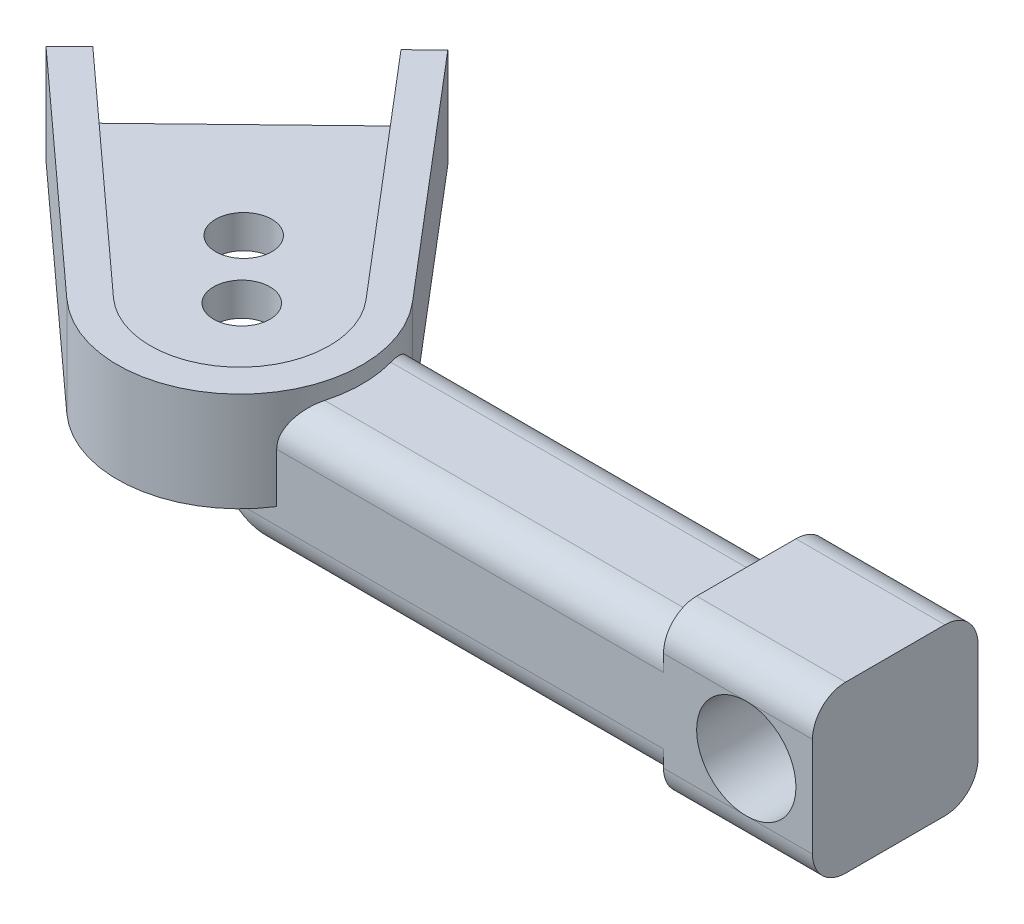
ISO-10303-21;
HEADER;
FILE_DESCRIPTION(('STEP AP214'),'2;1');
FILE_NAME('part.step','',(''),(''),'','','');
FILE_SCHEMA(('AUTOMOTIVE_DESIGN { 1 0 10303 214 1 1 1 1 }'));
ENDSEC;
DATA;
#1=APPLICATION_CONTEXT('core data for automotive mechanical design processes');
#2=APPLICATION_PROTOCOL_DEFINITION('international standard','automotive_design',2000,#1);
#3=PRODUCT_CONTEXT('',#1,'mechanical');
#4=PRODUCT('Part','Part','',(#3));
#5=PRODUCT_RELATED_PRODUCT_CATEGORY('part','',(#4));
#6=PRODUCT_DEFINITION_FORMATION('','',#4);
#7=PRODUCT_DEFINITION_CONTEXT('part definition',#1,'design');
#8=PRODUCT_DEFINITION('design','',#6,#7);
#9=PRODUCT_DEFINITION_SHAPE('','',#8);
#10=(LENGTH_UNIT() NAMED_UNIT(*) SI_UNIT(.MILLI.,.METRE.));
#11=(NAMED_UNIT(*) PLANE_ANGLE_UNIT() SI_UNIT($,.RADIAN.));
#12=(NAMED_UNIT(*) SI_UNIT($,.STERADIAN.) SOLID_ANGLE_UNIT());
#13=UNCERTAINTY_MEASURE_WITH_UNIT(LENGTH_MEASURE(1.E-05),#10,'distance_accuracy_value','');
#14=(GEOMETRIC_REPRESENTATION_CONTEXT(3) GLOBAL_UNCERTAINTY_ASSIGNED_CONTEXT((#13)) GLOBAL_UNIT_ASSIGNED_CONTEXT((#10,
#11,#12)) REPRESENTATION_CONTEXT('',''));
#15=CARTESIAN_POINT('',(0.,0.,0.));
#16=DIRECTION('',(0.,0.,1.));
#17=DIRECTION('',(1.,0.,0.));
#18=AXIS2_PLACEMENT_3D('',#15,#16,#17);
#19=CARTESIAN_POINT('',(0.,0.,2.));
#20=DIRECTION('',(0.,0.,1.));
#21=DIRECTION('',(1.,0.,0.));
#22=AXIS2_PLACEMENT_3D('',#19,#20,#21);
#23=PLANE('',#22);
#24=DIRECTION('',(0.,1.,0.));
#25=VECTOR('',#24,1.);
#26=CARTESIAN_POINT('',(10.25,2.,2.));
#27=LINE('',#26,#25);
#28=CARTESIAN_POINT('',(10.25,-1.5,2.));
#29=VERTEX_POINT('',#28);
#30=CARTESIAN_POINT('',(10.25,1.5,2.));
#31=VERTEX_POINT('',#30);
#32=EDGE_CURVE('E337',#29,#31,#27,.T.);
#33=ORIENTED_EDGE('',*,*,#32,.T.);
#34=DIRECTION('',(-1.,0.,0.));
#35=VECTOR('',#34,1.);
#36=CARTESIAN_POINT('',(0.,1.5,2.));
#37=LINE('',#36,#35);
#38=CARTESIAN_POINT('',(8.25,1.5,2.));
#39=VERTEX_POINT('',#38);
#40=EDGE_CURVE('E11',#31,#39,#37,.T.);
#41=ORIENTED_EDGE('',*,*,#40,.T.);
#42=CARTESIAN_POINT('',(8.25,0.,2.));
#43=DIRECTION('',(0.,0.,1.));
#44=DIRECTION('',(1.,0.,0.));
#45=AXIS2_PLACEMENT_3D('',#42,#43,#44);
#46=CIRCLE('',#45,1.5);
#47=CARTESIAN_POINT('',(8.25,-1.5,2.));
#48=VERTEX_POINT('',#47);
#49=EDGE_CURVE('E385',#48,#39,#46,.T.);
#50=ORIENTED_EDGE('',*,*,#49,.F.);
#51=DIRECTION('',(1.,0.,0.));
#52=VECTOR('',#51,1.);
#53=CARTESIAN_POINT('',(0.,-1.5,2.));
#54=LINE('',#53,#52);
#55=EDGE_CURVE('E49',#48,#29,#54,.T.);
#56=ORIENTED_EDGE('',*,*,#55,.T.);
#57=EDGE_LOOP('',(#33,#41,#50,#56));
#58=FACE_BOUND('',#57,.T.);
#59=ADVANCED_FACE('F34',(#58),#23,.T.);
#60=CARTESIAN_POINT('',(0.,0.,-3.));
#61=DIRECTION('',(0.,0.,1.));
#62=DIRECTION('',(1.,0.,0.));
#63=AXIS2_PLACEMENT_3D('',#60,#61,#62);
#64=PLANE('',#63);
#65=DIRECTION('',(0.,1.,0.));
#66=VECTOR('',#65,1.);
#67=CARTESIAN_POINT('',(10.25,-2.5,-3.));
#68=LINE('',#67,#66);
#69=CARTESIAN_POINT('',(10.25,-1.5,-3.));
#70=VERTEX_POINT('',#69);
#71=CARTESIAN_POINT('',(10.25,1.5,-3.));
#72=VERTEX_POINT('',#71);
#73=EDGE_CURVE('E393',#70,#72,#68,.T.);
#74=ORIENTED_EDGE('',*,*,#73,.F.);
#75=DIRECTION('',(1.,0.,0.));
#76=VECTOR('',#75,1.);
#77=CARTESIAN_POINT('',(5.75,-1.5,-3.));
#78=LINE('',#77,#76);
#79=CARTESIAN_POINT('',(8.25,-1.5,-3.));
#80=VERTEX_POINT('',#79);
#81=EDGE_CURVE('E365',#70,#80,#78,.F.);
#82=ORIENTED_EDGE('',*,*,#81,.T.);
#83=CARTESIAN_POINT('',(8.25,0.,-3.));
#84=DIRECTION('',(0.,0.,1.));
#85=DIRECTION('',(1.,0.,0.));
#86=AXIS2_PLACEMENT_3D('',#83,#84,#85);
#87=CIRCLE('',#86,1.5);
#88=CARTESIAN_POINT('',(8.25,1.5,-3.));
#89=VERTEX_POINT('',#88);
#90=EDGE_CURVE('E550',#80,#89,#87,.T.);
#91=ORIENTED_EDGE('',*,*,#90,.T.);
#92=DIRECTION('',(-1.,0.,0.));
#93=VECTOR('',#92,1.);
#94=CARTESIAN_POINT('',(10.25,1.5,-3.));
#95=LINE('',#94,#93);
#96=EDGE_CURVE('E359',#89,#72,#95,.F.);
#97=ORIENTED_EDGE('',*,*,#96,.T.);
#98=EDGE_LOOP('',(#74,#82,#91,#97));
#99=FACE_BOUND('',#98,.T.);
#100=ADVANCED_FACE('F326',(#99),#64,.F.);
#101=CARTESIAN_POINT('',(-9.048459148222,2.5,0.));
#102=DIRECTION('',(0.,-1.,0.));
#103=DIRECTION('',(0.,0.,-1.));
#104=AXIS2_PLACEMENT_3D('',#101,#102,#103);
#105=CYLINDRICAL_SURFACE('',#104,2.70313224699939);
#106=CARTESIAN_POINT('',(-9.048459148222,0.500000000000001,0.));
#107=DIRECTION('',(0.,-1.,0.));
#108=DIRECTION('',(0.,0.,-1.));
#109=AXIS2_PLACEMENT_3D('',#106,#107,#108);
#110=CIRCLE('',#109,2.70313224699939);
#111=CARTESIAN_POINT('',(-6.98942026153455,0.500000000000001,-1.75136598341891));
#112=VERTEX_POINT('',#111);
#113=CARTESIAN_POINT('',(-10.8670736672092,0.500000000000001,1.99989129106982));
#114=VERTEX_POINT('',#113);
#115=EDGE_CURVE('E431',#112,#114,#110,.T.);
#116=ORIENTED_EDGE('',*,*,#115,.T.);
#117=DIRECTION('',(0.,-1.,0.));
#118=VECTOR('',#117,1.);
#119=CARTESIAN_POINT('',(-10.8670736672092,2.5,1.99989129106982));
#120=LINE('',#119,#118);
#121=CARTESIAN_POINT('',(-10.8670736672092,2.5,1.99989129106982));
#122=VERTEX_POINT('',#121);
#123=EDGE_CURVE('E457',#122,#114,#120,.T.);
#124=ORIENTED_EDGE('',*,*,#123,.F.);
#125=CARTESIAN_POINT('',(-9.048459148222,2.5,0.));
#126=DIRECTION('',(0.,-1.,0.));
#127=DIRECTION('',(0.,0.,-1.));
#128=AXIS2_PLACEMENT_3D('',#125,#126,#127);
#129=CIRCLE('',#128,2.70313224699939);
#130=CARTESIAN_POINT('',(-6.98942026153455,2.5,-1.75136598341891));
#131=VERTEX_POINT('',#130);
#132=EDGE_CURVE('E448',#131,#122,#129,.T.);
#133=ORIENTED_EDGE('',*,*,#132,.F.);
#134=DIRECTION('',(0.,-1.,0.));
#135=VECTOR('',#134,1.);
#136=CARTESIAN_POINT('',(-6.98942026153455,2.5,-1.75136598341891));
#137=LINE('',#136,#135);
#138=EDGE_CURVE('E458',#131,#112,#137,.T.);
#139=ORIENTED_EDGE('',*,*,#138,.T.);
#140=EDGE_LOOP('',(#116,#124,#133,#139));
#141=FACE_BOUND('',#140,.T.);
#142=ADVANCED_FACE('F331',(#141),#105,.F.);
#143=CARTESIAN_POINT('',(-13.0110338618794,2.5,-8.83083234344946));
#144=DIRECTION('',(0.761723326327479,0.,-0.647902441829478));
#145=DIRECTION('',(-0.647902441829478,0.,-0.761723326327479));
#146=AXIS2_PLACEMENT_3D('',#143,#144,#145);
#147=PLANE('',#146);
#148=DIRECTION('',(0.647902441829478,0.,0.761723326327479));
#149=VECTOR('',#148,1.);
#150=CARTESIAN_POINT('',(-13.0110338618794,0.500000000000001,-8.83083234344946));
#151=LINE('',#150,#149);
#152=CARTESIAN_POINT('',(-13.0110338618794,0.500000000000001,-8.83083234344946));
#153=VERTEX_POINT('',#152);
#154=EDGE_CURVE('E446',#153,#112,#151,.T.);
#155=ORIENTED_EDGE('',*,*,#154,.T.);
#156=ORIENTED_EDGE('',*,*,#138,.F.);
#157=DIRECTION('',(0.647902441829478,0.,0.761723326327479));
#158=VECTOR('',#157,1.);
#159=CARTESIAN_POINT('',(-13.0110338618794,2.5,-8.83083234344946));
#160=LINE('',#159,#158);
#161=CARTESIAN_POINT('',(-13.0110338618794,2.5,-8.83083234344946));
#162=VERTEX_POINT('',#161);
#163=EDGE_CURVE('E454',#162,#131,#160,.T.);
#164=ORIENTED_EDGE('',*,*,#163,.F.);
#165=DIRECTION('',(0.,-1.,0.));
#166=VECTOR('',#165,1.);
#167=CARTESIAN_POINT('',(-13.0110338618794,2.5,-8.83083234344946));
#168=LINE('',#167,#166);
#169=EDGE_CURVE('E480',#162,#153,#168,.T.);
#170=ORIENTED_EDGE('',*,*,#169,.T.);
#171=EDGE_LOOP('',(#155,#156,#164,#170));
#172=FACE_BOUND('',#171,.T.);
#173=ADVANCED_FACE('F603',(#172),#147,.F.);
#174=CARTESIAN_POINT('',(-17.7428729960787,2.5,-4.25266280772598));
#175=DIRECTION('',(-0.672780446093956,0.,0.739842193547798));
#176=DIRECTION('',(0.739842193547798,0.,0.672780446093956));
#177=AXIS2_PLACEMENT_3D('',#174,#175,#176);
#178=PLANE('',#177);
#179=DIRECTION('',(-0.739842193547798,0.,-0.672780446093956));
#180=VECTOR('',#179,1.);
#181=CARTESIAN_POINT('',(-17.7428729960787,0.500000000000001,-4.25266280772598));
#182=LINE('',#181,#180);
#183=CARTESIAN_POINT('',(-17.7428729960787,0.500000000000001,-4.25266280772598));
#184=VERTEX_POINT('',#183);
#185=EDGE_CURVE('E441',#114,#184,#182,.T.);
#186=ORIENTED_EDGE('',*,*,#185,.T.);
#187=DIRECTION('',(0.,-1.,0.));
#188=VECTOR('',#187,1.);
#189=CARTESIAN_POINT('',(-17.7428729960787,2.5,-4.25266280772598));
#190=LINE('',#189,#188);
#191=CARTESIAN_POINT('',(-17.7428729960787,2.5,-4.25266280772598));
#192=VERTEX_POINT('',#191);
#193=EDGE_CURVE('E492',#192,#184,#190,.T.);
#194=ORIENTED_EDGE('',*,*,#193,.F.);
#195=DIRECTION('',(-0.739842193547798,0.,-0.672780446093956));
#196=VECTOR('',#195,1.);
#197=CARTESIAN_POINT('',(-17.7428729960787,2.5,-4.25266280772598));
#198=LINE('',#197,#196);
#199=EDGE_CURVE('E451',#122,#192,#198,.T.);
#200=ORIENTED_EDGE('',*,*,#199,.F.);
#201=ORIENTED_EDGE('',*,*,#123,.T.);
#202=EDGE_LOOP('',(#186,#194,#200,#201));
#203=FACE_BOUND('',#202,.T.);
#204=ADVANCED_FACE('F303',(#203),#178,.F.);
#205=CARTESIAN_POINT('',(10.25,2.,2.));
#206=DIRECTION('',(-1.,0.,0.));
#207=DIRECTION('',(0.,-1.,0.));
#208=AXIS2_PLACEMENT_3D('',#205,#206,#207);
#209=PLANE('',#208);
#210=DIRECTION('',(0.,0.,1.));
#211=VECTOR('',#210,1.);
#212=CARTESIAN_POINT('',(10.25,-2.5,-3.));
#213=LINE('',#212,#211);
#214=CARTESIAN_POINT('',(10.25,-2.5,-2.));
#215=VERTEX_POINT('',#214);
#216=CARTESIAN_POINT('',(10.25,-2.5,1.));
#217=VERTEX_POINT('',#216);
#218=EDGE_CURVE('E403',#215,#217,#213,.T.);
#219=ORIENTED_EDGE('',*,*,#218,.F.);
#220=CARTESIAN_POINT('',(10.25,-1.5,-2.));
#221=DIRECTION('',(-1.,0.,0.));
#222=DIRECTION('',(0.,-1.,0.));
#223=AXIS2_PLACEMENT_3D('',#220,#221,#222);
#224=CIRCLE('',#223,1.);
#225=EDGE_CURVE('E352',#215,#70,#224,.F.);
#226=ORIENTED_EDGE('',*,*,#225,.T.);
#227=ORIENTED_EDGE('',*,*,#73,.T.);
#228=CARTESIAN_POINT('',(10.25,1.5,-2.));
#229=DIRECTION('',(-1.,0.,0.));
#230=DIRECTION('',(0.,-1.,0.));
#231=AXIS2_PLACEMENT_3D('',#228,#229,#230);
#232=CIRCLE('',#231,1.);
#233=CARTESIAN_POINT('',(10.25,2.5,-2.));
#234=VERTEX_POINT('',#233);
#235=EDGE_CURVE('E349',#72,#234,#232,.F.);
#236=ORIENTED_EDGE('',*,*,#235,.T.);
#237=DIRECTION('',(0.,0.,1.));
#238=VECTOR('',#237,1.);
#239=CARTESIAN_POINT('',(10.25,2.5,-3.));
#240=LINE('',#239,#238);
#241=CARTESIAN_POINT('',(10.25,2.5,1.));
#242=VERTEX_POINT('',#241);
#243=EDGE_CURVE('E401',#234,#242,#240,.T.);
#244=ORIENTED_EDGE('',*,*,#243,.T.);
#245=CARTESIAN_POINT('',(10.25,1.5,1.));
#246=DIRECTION('',(-1.,0.,0.));
#247=DIRECTION('',(0.,-1.,0.));
#248=AXIS2_PLACEMENT_3D('',#245,#246,#247);
#249=CIRCLE('',#248,1.);
#250=EDGE_CURVE('E346',#242,#31,#249,.F.);
#251=ORIENTED_EDGE('',*,*,#250,.T.);
#252=ORIENTED_EDGE('',*,*,#32,.F.);
#253=CARTESIAN_POINT('',(10.25,-1.5,1.));
#254=DIRECTION('',(-1.,0.,0.));
#255=DIRECTION('',(0.,-1.,0.));
#256=AXIS2_PLACEMENT_3D('',#253,#254,#255);
#257=CIRCLE('',#256,1.);
#258=EDGE_CURVE('E350',#29,#217,#257,.F.);
#259=ORIENTED_EDGE('',*,*,#258,.T.);
#260=EDGE_LOOP('',(#219,#226,#227,#236,#244,#251,#252,#259));
#261=FACE_BOUND('',#260,.T.);
#262=ADVANCED_FACE('F299',(#261),#209,.F.);
#263=CARTESIAN_POINT('',(-10.25,2.,2.));
#264=DIRECTION('',(0.,-1.,0.));
#265=DIRECTION('',(0.,0.,-1.));
#266=AXIS2_PLACEMENT_3D('',#263,#264,#265);
#267=PLANE('',#266);
#268=DIRECTION('',(-1.,0.,0.));
#269=VECTOR('',#268,1.);
#270=CARTESIAN_POINT('',(10.25,2.,1.));
#271=LINE('',#270,#269);
#272=CARTESIAN_POINT('',(-5.48615652211062,2.,1.));
#273=VERTEX_POINT('',#272);
#274=CARTESIAN_POINT('',(5.75,2.,1.));
#275=VERTEX_POINT('',#274);
#276=EDGE_CURVE('E513',#273,#275,#271,.F.);
#277=ORIENTED_EDGE('',*,*,#276,.T.);
#278=DIRECTION('',(0.,0.,-1.));
#279=VECTOR('',#278,1.);
#280=CARTESIAN_POINT('',(5.75,2.,2.));
#281=LINE('',#280,#279);
#282=CARTESIAN_POINT('',(5.75,2.,-1.));
#283=VERTEX_POINT('',#282);
#284=EDGE_CURVE('E234',#275,#283,#281,.T.);
#285=ORIENTED_EDGE('',*,*,#284,.T.);
#286=DIRECTION('',(-1.,0.,0.));
#287=VECTOR('',#286,1.);
#288=CARTESIAN_POINT('',(-10.25,2.,-1.));
#289=LINE('',#288,#287);
#290=CARTESIAN_POINT('',(-5.48615652211062,2.,-1.));
#291=VERTEX_POINT('',#290);
#292=EDGE_CURVE('E249',#283,#291,#289,.T.);
#293=ORIENTED_EDGE('',*,*,#292,.T.);
#294=CARTESIAN_POINT('',(-9.048459148222,2.,0.));
#295=DIRECTION('',(0.,-1.,0.));
#296=DIRECTION('',(0.,0.,-1.));
#297=AXIS2_PLACEMENT_3D('',#294,#295,#296);
#298=CIRCLE('',#297,3.7);
#299=EDGE_CURVE('E286',#291,#273,#298,.T.);
#300=ORIENTED_EDGE('',*,*,#299,.T.);
#301=EDGE_LOOP('',(#277,#285,#293,#300));
#302=FACE_BOUND('',#301,.T.);
#303=ADVANCED_FACE('F302',(#302),#267,.F.);
#304=CARTESIAN_POINT('',(-10.25,-2.,2.));
#305=DIRECTION('',(0.,1.,0.));
#306=DIRECTION('',(0.,0.,1.));
#307=AXIS2_PLACEMENT_3D('',#304,#305,#306);
#308=PLANE('',#307);
#309=DIRECTION('',(1.,0.,0.));
#310=VECTOR('',#309,1.);
#311=CARTESIAN_POINT('',(-10.25,-2.,-1.));
#312=LINE('',#311,#310);
#313=CARTESIAN_POINT('',(-6.25,-2.,-1.));
#314=VERTEX_POINT('',#313);
#315=CARTESIAN_POINT('',(5.75,-2.,-1.));
#316=VERTEX_POINT('',#315);
#317=EDGE_CURVE('E890',#314,#316,#312,.T.);
#318=ORIENTED_EDGE('',*,*,#317,.T.);
#319=DIRECTION('',(0.,0.,1.));
#320=VECTOR('',#319,1.);
#321=CARTESIAN_POINT('',(5.75,-2.,2.));
#322=LINE('',#321,#320);
#323=CARTESIAN_POINT('',(5.75,-2.,1.));
#324=VERTEX_POINT('',#323);
#325=EDGE_CURVE('E400',#316,#324,#322,.T.);
#326=ORIENTED_EDGE('',*,*,#325,.T.);
#327=DIRECTION('',(1.,0.,0.));
#328=VECTOR('',#327,1.);
#329=CARTESIAN_POINT('',(-10.25,-2.,1.));
#330=LINE('',#329,#328);
#331=CARTESIAN_POINT('',(-6.25,-2.,1.));
#332=VERTEX_POINT('',#331);
#333=EDGE_CURVE('E340',#324,#332,#330,.F.);
#334=ORIENTED_EDGE('',*,*,#333,.T.);
#335=DIRECTION('',(0.,0.,1.));
#336=VECTOR('',#335,1.);
#337=CARTESIAN_POINT('',(-6.25,-2.,-2.));
#338=LINE('',#337,#336);
#339=EDGE_CURVE('E341',#314,#332,#338,.T.);
#340=ORIENTED_EDGE('',*,*,#339,.F.);
#341=EDGE_LOOP('',(#318,#326,#334,#340));
#342=FACE_BOUND('',#341,.T.);
#343=ADVANCED_FACE('F307',(#342),#308,.F.);
#344=EDGE_CURVE('E383',#39,#48,#46,.T.);
#345=ORIENTED_EDGE('',*,*,#344,.F.);
#346=DIRECTION('',(-1.,0.,0.));
#347=VECTOR('',#346,1.);
#348=CARTESIAN_POINT('',(0.,1.5,2.));
#349=LINE('',#348,#347);
#350=CARTESIAN_POINT('',(5.75,1.5,2.));
#351=VERTEX_POINT('',#350);
#352=EDGE_CURVE('E42',#39,#351,#349,.T.);
#353=ORIENTED_EDGE('',*,*,#352,.T.);
#354=DIRECTION('',(0.,-1.,0.));
#355=VECTOR('',#354,1.);
#356=CARTESIAN_POINT('',(5.75,2.5,2.));
#357=LINE('',#356,#355);
#358=CARTESIAN_POINT('',(5.75,1.,2.));
#359=VERTEX_POINT('',#358);
#360=EDGE_CURVE('E218',#351,#359,#357,.T.);
#361=ORIENTED_EDGE('',*,*,#360,.T.);
#362=DIRECTION('',(-1.,0.,0.));
#363=VECTOR('',#362,1.);
#364=CARTESIAN_POINT('',(-10.25,1.,2.));
#365=LINE('',#364,#363);
#366=CARTESIAN_POINT('',(-5.93558266496732,1.,2.));
#367=VERTEX_POINT('',#366);
#368=EDGE_CURVE('E223',#359,#367,#365,.T.);
#369=ORIENTED_EDGE('',*,*,#368,.T.);
#370=DIRECTION('',(0.,-1.,0.));
#371=VECTOR('',#370,1.);
#372=CARTESIAN_POINT('',(-5.93558266496732,2.5,2.));
#373=LINE('',#372,#371);
#374=CARTESIAN_POINT('',(-5.93558266496732,-0.499999999999999,2.));
#375=VERTEX_POINT('',#374);
#376=EDGE_CURVE('E510',#375,#367,#373,.F.);
#377=ORIENTED_EDGE('',*,*,#376,.F.);
#378=DIRECTION('',(1.,0.,0.));
#379=VECTOR('',#378,1.);
#380=CARTESIAN_POINT('',(0.,-0.499999999999999,2.));
#381=LINE('',#380,#379);
#382=CARTESIAN_POINT('',(-7.75,-0.499999999999999,2.));
#383=VERTEX_POINT('',#382);
#384=EDGE_CURVE('E508',#383,#375,#381,.T.);
#385=ORIENTED_EDGE('',*,*,#384,.F.);
#386=DIRECTION('',(0.707106781186547,-0.707106781186548,0.));
#387=VECTOR('',#386,1.);
#388=CARTESIAN_POINT('',(-7.75,-0.499999999999999,2.));
#389=LINE('',#388,#387);
#390=CARTESIAN_POINT('',(-7.25,-0.999999999999999,2.));
#391=VERTEX_POINT('',#390);
#392=EDGE_CURVE('E420',#383,#391,#389,.T.);
#393=ORIENTED_EDGE('',*,*,#392,.T.);
#394=DIRECTION('',(1.,0.,0.));
#395=VECTOR('',#394,1.);
#396=CARTESIAN_POINT('',(10.25,-0.999999999999999,2.));
#397=LINE('',#396,#395);
#398=CARTESIAN_POINT('',(5.75,-0.999999999999999,2.));
#399=VERTEX_POINT('',#398);
#400=EDGE_CURVE('E244',#391,#399,#397,.T.);
#401=ORIENTED_EDGE('',*,*,#400,.T.);
#402=CARTESIAN_POINT('',(5.75,-1.5,2.));
#403=VERTEX_POINT('',#402);
#404=EDGE_CURVE('E227',#399,#403,#357,.T.);
#405=ORIENTED_EDGE('',*,*,#404,.T.);
#406=DIRECTION('',(1.,0.,0.));
#407=VECTOR('',#406,1.);
#408=CARTESIAN_POINT('',(0.,-1.5,2.));
#409=LINE('',#408,#407);
#410=EDGE_CURVE('E380',#403,#48,#409,.T.);
#411=ORIENTED_EDGE('',*,*,#410,.T.);
#412=EDGE_LOOP('',(#345,#353,#361,#369,#377,#385,#393,#401,#405,#411));
#413=FACE_BOUND('',#412,.T.);
#414=ADVANCED_FACE('F221',(#413),#23,.T.);
#415=CARTESIAN_POINT('',(0.,0.,-2.));
#416=DIRECTION('',(0.,0.,1.));
#417=DIRECTION('',(1.,0.,0.));
#418=AXIS2_PLACEMENT_3D('',#415,#416,#417);
#419=PLANE('',#418);
#420=DIRECTION('',(-1.,0.,0.));
#421=VECTOR('',#420,1.);
#422=CARTESIAN_POINT('',(0.,1.,-2.));
#423=LINE('',#422,#421);
#424=CARTESIAN_POINT('',(-5.93558266496732,1.,-2.));
#425=VERTEX_POINT('',#424);
#426=CARTESIAN_POINT('',(5.75,1.,-2.));
#427=VERTEX_POINT('',#426);
#428=EDGE_CURVE('E891',#425,#427,#423,.F.);
#429=ORIENTED_EDGE('',*,*,#428,.T.);
#430=DIRECTION('',(0.,-1.,0.));
#431=VECTOR('',#430,1.);
#432=CARTESIAN_POINT('',(5.75,0.,-2.));
#433=LINE('',#432,#431);
#434=CARTESIAN_POINT('',(5.75,-0.999999999999999,-2.));
#435=VERTEX_POINT('',#434);
#436=EDGE_CURVE('E412',#427,#435,#433,.T.);
#437=ORIENTED_EDGE('',*,*,#436,.T.);
#438=DIRECTION('',(1.,0.,0.));
#439=VECTOR('',#438,1.);
#440=CARTESIAN_POINT('',(0.,-0.999999999999999,-2.));
#441=LINE('',#440,#439);
#442=CARTESIAN_POINT('',(-7.25,-0.999999999999999,-2.));
#443=VERTEX_POINT('',#442);
#444=EDGE_CURVE('E516',#435,#443,#441,.F.);
#445=ORIENTED_EDGE('',*,*,#444,.T.);
#446=DIRECTION('',(-0.707106781186547,0.707106781186548,0.));
#447=VECTOR('',#446,1.);
#448=CARTESIAN_POINT('',(-7.75,-0.499999999999999,-2.));
#449=LINE('',#448,#447);
#450=CARTESIAN_POINT('',(-7.75,-0.499999999999999,-2.));
#451=VERTEX_POINT('',#450);
#452=EDGE_CURVE('E421',#443,#451,#449,.T.);
#453=ORIENTED_EDGE('',*,*,#452,.T.);
#454=DIRECTION('',(1.,0.,0.));
#455=VECTOR('',#454,1.);
#456=CARTESIAN_POINT('',(0.,-0.499999999999999,-2.));
#457=LINE('',#456,#455);
#458=CARTESIAN_POINT('',(-5.93558266496732,-0.499999999999999,-2.));
#459=VERTEX_POINT('',#458);
#460=EDGE_CURVE('E495',#451,#459,#457,.T.);
#461=ORIENTED_EDGE('',*,*,#460,.T.);
#462=DIRECTION('',(0.,-1.,0.));
#463=VECTOR('',#462,1.);
#464=CARTESIAN_POINT('',(-5.93558266496732,2.5,-2.));
#465=LINE('',#464,#463);
#466=EDGE_CURVE('E285',#459,#425,#465,.F.);
#467=ORIENTED_EDGE('',*,*,#466,.T.);
#468=EDGE_LOOP('',(#429,#437,#445,#453,#461,#467));
#469=FACE_BOUND('',#468,.T.);
#470=ADVANCED_FACE('F297',(#469),#419,.F.);
#471=CARTESIAN_POINT('',(-10.25,-0.999999999999999,-1.));
#472=DIRECTION('',(1.,0.,0.));
#473=DIRECTION('',(0.,0.,-1.));
#474=AXIS2_PLACEMENT_3D('',#471,#472,#473);
#475=CYLINDRICAL_SURFACE('',#474,1.);
#476=CARTESIAN_POINT('',(5.75,-0.999999999999999,-1.));
#477=DIRECTION('',(-1.,0.,0.));
#478=DIRECTION('',(0.,0.,1.));
#479=AXIS2_PLACEMENT_3D('',#476,#477,#478);
#480=CIRCLE('',#479,1.);
#481=EDGE_CURVE('E410',#316,#435,#480,.F.);
#482=ORIENTED_EDGE('',*,*,#481,.F.);
#483=ORIENTED_EDGE('',*,*,#317,.F.);
#484=CARTESIAN_POINT('',(-7.25,-0.999999999999999,-1.));
#485=DIRECTION('',(-0.707106781186548,-0.707106781186547,0.));
#486=DIRECTION('',(0.707106781186547,-0.707106781186548,0.));
#487=AXIS2_PLACEMENT_3D('',#484,#485,#486);
#488=ELLIPSE('',#487,1.41421356237309,1.);
#489=EDGE_CURVE('E246',#314,#443,#488,.F.);
#490=ORIENTED_EDGE('',*,*,#489,.T.);
#491=ORIENTED_EDGE('',*,*,#444,.F.);
#492=EDGE_LOOP('',(#482,#483,#490,#491));
#493=FACE_BOUND('',#492,.T.);
#494=ADVANCED_FACE('F293',(#493),#475,.T.);
#495=CARTESIAN_POINT('',(-10.25,1.,-1.));
#496=DIRECTION('',(-1.,0.,0.));
#497=DIRECTION('',(0.,0.,1.));
#498=AXIS2_PLACEMENT_3D('',#495,#496,#497);
#499=CYLINDRICAL_SURFACE('',#498,1.);
#500=CARTESIAN_POINT('',(5.75,1.,-1.));
#501=DIRECTION('',(-1.,0.,0.));
#502=DIRECTION('',(0.,0.,1.));
#503=AXIS2_PLACEMENT_3D('',#500,#501,#502);
#504=CIRCLE('',#503,1.);
#505=EDGE_CURVE('E415',#427,#283,#504,.F.);
#506=ORIENTED_EDGE('',*,*,#505,.F.);
#507=ORIENTED_EDGE('',*,*,#428,.F.);
#508=CARTESIAN_POINT('',(-5.48615652211062,2.,-1.));
#509=CARTESIAN_POINT('',(-5.49448512751093,1.99999986674896,-1.02967721367068));
#510=CARTESIAN_POINT('',(-5.50318402159039,1.99867845329531,-1.05923040841247));
#511=CARTESIAN_POINT('',(-5.5212422160807,1.99346314114093,-1.11789064499152));
#512=CARTESIAN_POINT('',(-5.53060120892809,1.98957043351677,-1.14699788701878));
#513=CARTESIAN_POINT('',(-5.55948881554321,1.97417660572894,-1.23318161586856));
#514=CARTESIAN_POINT('',(-5.57989086328832,1.95895868313582,-1.2893425408133));
#515=CARTESIAN_POINT('',(-5.62208301024292,1.91936215819538,-1.39761510342952));
#516=CARTESIAN_POINT('',(-5.64387108748472,1.89499665704556,-1.44973240419243));
#517=CARTESIAN_POINT('',(-5.68786293345461,1.83779636606047,-1.54898094014649));
#518=CARTESIAN_POINT('',(-5.71006711042998,1.8049528060166,-1.59610694041713));
#519=CARTESIAN_POINT('',(-5.75469479974584,1.72975172257994,-1.68634747782494));
#520=CARTESIAN_POINT('',(-5.7770800166405,1.68702113103693,-1.72917138814211));
#521=CARTESIAN_POINT('',(-5.81936953191324,1.59377510301419,-1.80691487463551));
#522=CARTESIAN_POINT('',(-5.8392737876778,1.54325953285131,-1.84183431505127));
#523=CARTESIAN_POINT('',(-5.87397310571555,1.43784547181252,-1.90099100230321));
#524=CARTESIAN_POINT('',(-5.88895305386543,1.38323400599391,-1.9256275268256));
#525=CARTESIAN_POINT('',(-5.91321473602806,1.26941353893407,-1.96488863091029));
#526=CARTESIAN_POINT('',(-5.92251494031953,1.21022015319771,-1.97954568134315));
#527=CARTESIAN_POINT('',(-5.9307414839792,1.12520934470243,-1.99244875726909));
#528=CARTESIAN_POINT('',(-5.93255129826535,1.10028723162081,-1.99527560356141));
#529=CARTESIAN_POINT('',(-5.93497258784965,1.05024936373215,-1.99905103320968));
#530=CARTESIAN_POINT('',(-5.93558433763758,1.02513365460426,-2.00000004679829));
#531=CARTESIAN_POINT('',(-5.93558266496732,1.,-2.));
#532=B_SPLINE_CURVE_WITH_KNOTS('',3,(#508,#509,#510,#511,#512,#513,#514,#515,#516,#517,#518,
#519,#520,#521,#522,#523,#524,#525,#526,#527,#528,#529,#530,#531),.UNSPECIFIED.,.F.,.F.,(4,2,2,
2,2,2,2,2,2,2,2,4),(0.,0.092404913983302,0.184767054090679,0.368807189976303,0.552584742202953,
0.736553172086413,0.929124182468293,1.12169850003567,1.30587873300925,1.48945678549823,
1.56481491269759,1.64015577249906),.UNSPECIFIED.);
#533=EDGE_CURVE('E277',#291,#425,#532,.T.);
#534=ORIENTED_EDGE('',*,*,#533,.F.);
#535=ORIENTED_EDGE('',*,*,#292,.F.);
#536=EDGE_LOOP('',(#506,#507,#534,#535));
#537=FACE_BOUND('',#536,.T.);
#538=ADVANCED_FACE('F289',(#537),#499,.T.);
#539=CARTESIAN_POINT('',(0.,1.,1.));
#540=DIRECTION('',(1.,0.,0.));
#541=DIRECTION('',(0.,0.,-1.));
#542=AXIS2_PLACEMENT_3D('',#539,#540,#541);
#543=CYLINDRICAL_SURFACE('',#542,1.);
#544=CARTESIAN_POINT('',(5.75,1.,1.));
#545=DIRECTION('',(-1.,0.,0.));
#546=DIRECTION('',(0.,0.,1.));
#547=AXIS2_PLACEMENT_3D('',#544,#545,#546);
#548=CIRCLE('',#547,1.);
#549=EDGE_CURVE('E230',#275,#359,#548,.F.);
#550=ORIENTED_EDGE('',*,*,#549,.F.);
#551=ORIENTED_EDGE('',*,*,#276,.F.);
#552=CARTESIAN_POINT('',(-5.93558266496732,1.,2.));
#553=CARTESIAN_POINT('',(-5.93558612020447,1.02543408517232,2.00000206190087));
#554=CARTESIAN_POINT('',(-5.93495859448017,1.05085387027687,1.99902896416392));
#555=CARTESIAN_POINT('',(-5.93247814529819,1.10147261144077,1.99516175980056));
#556=CARTESIAN_POINT('',(-5.93062591422876,1.12667168412857,1.9922687386012));
#557=CARTESIAN_POINT('',(-5.92331888968501,1.20135537215031,1.98080386714773));
#558=CARTESIAN_POINT('',(-5.91611272669317,1.25027443639966,1.96944528885243));
#559=CARTESIAN_POINT('',(-5.89773025574633,1.3450476186863,1.93989795781832));
#560=CARTESIAN_POINT('',(-5.88656137921598,1.39090728416764,1.9217219863695));
#561=CARTESIAN_POINT('',(-5.86114248571436,1.47883876294319,1.87926158365092));
#562=CARTESIAN_POINT('',(-5.84688808225339,1.52090506159135,1.8549684479008));
#563=CARTESIAN_POINT('',(-5.81499248105137,1.60379152612823,1.79883713545769));
#564=CARTESIAN_POINT('',(-5.79717048593364,1.64423483171616,1.76654723060019));
#565=CARTESIAN_POINT('',(-5.76009653644031,1.71935631020781,1.69653827621431));
#566=CARTESIAN_POINT('',(-5.7408438745397,1.75403160276388,1.65881653164788));
#567=CARTESIAN_POINT('',(-5.6992032170342,1.82144235157948,1.57322632337107));
#568=CARTESIAN_POINT('',(-5.67674499039213,1.85327221869883,1.52467561146244));
#569=CARTESIAN_POINT('',(-5.63243175247565,1.90815526885165,1.42262223577137));
#570=CARTESIAN_POINT('',(-5.6105764536355,1.93121270543729,1.36912198759098));
#571=CARTESIAN_POINT('',(-5.57058666182109,1.966001630284,1.26381722758929));
#572=CARTESIAN_POINT('',(-5.55229786839482,1.97862677599439,1.21236705938864));
#573=CARTESIAN_POINT('',(-5.51763196769773,1.99564101907832,1.1074246102433));
#574=CARTESIAN_POINT('',(-5.50125764604362,2.00001825198798,1.05392950029472));
#575=CARTESIAN_POINT('',(-5.48615652211062,2.,1.));
#576=B_SPLINE_CURVE_WITH_KNOTS('',3,(#552,#553,#554,#555,#556,#557,#558,#559,#560,#561,#562,
#563,#564,#565,#566,#567,#568,#569,#570,#571,#572,#573,#574,#575),.UNSPECIFIED.,.F.,.F.,(4,2,2,
2,2,2,2,2,2,2,2,4),(0.,0.0762485769023426,0.15245408341938,0.303836168245674,0.454935848235548,
0.606251764201984,0.769822890740579,0.933475455455206,1.11939077230644,1.30521582780984,
1.47268884563031,1.64040258679685),.UNSPECIFIED.);
#577=EDGE_CURVE('E242',#367,#273,#576,.T.);
#578=ORIENTED_EDGE('',*,*,#577,.F.);
#579=ORIENTED_EDGE('',*,*,#368,.F.);
#580=EDGE_LOOP('',(#550,#551,#578,#579));
#581=FACE_BOUND('',#580,.T.);
#582=ADVANCED_FACE('F240',(#581),#543,.T.);
#583=CARTESIAN_POINT('',(0.,-0.999999999999999,1.));
#584=DIRECTION('',(-1.,0.,0.));
#585=DIRECTION('',(0.,0.,1.));
#586=AXIS2_PLACEMENT_3D('',#583,#584,#585);
#587=CYLINDRICAL_SURFACE('',#586,1.);
#588=CARTESIAN_POINT('',(5.75,-0.999999999999999,1.));
#589=DIRECTION('',(-1.,0.,0.));
#590=DIRECTION('',(0.,0.,1.));
#591=AXIS2_PLACEMENT_3D('',#588,#589,#590);
#592=CIRCLE('',#591,1.);
#593=EDGE_CURVE('E544',#399,#324,#592,.F.);
#594=ORIENTED_EDGE('',*,*,#593,.F.);
#595=ORIENTED_EDGE('',*,*,#400,.F.);
#596=CARTESIAN_POINT('',(-7.25,-0.999999999999999,1.));
#597=DIRECTION('',(-0.707106781186548,-0.707106781186547,0.));
#598=DIRECTION('',(0.707106781186547,-0.707106781186548,0.));
#599=AXIS2_PLACEMENT_3D('',#596,#597,#598);
#600=ELLIPSE('',#599,1.41421356237309,1.);
#601=EDGE_CURVE('E238',#391,#332,#600,.F.);
#602=ORIENTED_EDGE('',*,*,#601,.T.);
#603=ORIENTED_EDGE('',*,*,#333,.F.);
#604=EDGE_LOOP('',(#594,#595,#602,#603));
#605=FACE_BOUND('',#604,.T.);
#606=ADVANCED_FACE('F317',(#605),#587,.T.);
#607=CARTESIAN_POINT('',(0.,-0.499999999999999,0.));
#608=DIRECTION('',(0.,-1.,0.));
#609=DIRECTION('',(0.,0.,-1.));
#610=AXIS2_PLACEMENT_3D('',#607,#608,#609);
#611=PLANE('',#610);
#612=DIRECTION('',(0.,0.,1.));
#613=VECTOR('',#612,1.);
#614=CARTESIAN_POINT('',(-7.75,-0.499999999999999,-4.12132034355964));
#615=LINE('',#614,#613);
#616=EDGE_CURVE('E424',#451,#383,#615,.T.);
#617=ORIENTED_EDGE('',*,*,#616,.T.);
#618=ORIENTED_EDGE('',*,*,#384,.T.);
#619=CARTESIAN_POINT('',(-9.048459148222,-0.499999999999999,0.));
#620=DIRECTION('',(0.,-1.,0.));
#621=DIRECTION('',(0.,0.,-1.));
#622=AXIS2_PLACEMENT_3D('',#619,#620,#621);
#623=CIRCLE('',#622,3.7);
#624=CARTESIAN_POINT('',(-11.5374283168385,-0.499999999999999,2.73770569595722));
#625=VERTEX_POINT('',#624);
#626=EDGE_CURVE('E486',#375,#625,#623,.T.);
#627=ORIENTED_EDGE('',*,*,#626,.T.);
#628=DIRECTION('',(-0.739920458366815,0.,-0.672694369896347));
#629=VECTOR('',#628,1.);
#630=CARTESIAN_POINT('',(-18.4615532820528,-0.499999999999999,-3.55732213830397));
#631=LINE('',#630,#629);
#632=CARTESIAN_POINT('',(-18.4615532820528,-0.499999999999999,-3.55732213830397));
#633=VERTEX_POINT('',#632);
#634=EDGE_CURVE('E468',#625,#633,#631,.T.);
#635=ORIENTED_EDGE('',*,*,#634,.T.);
#636=DIRECTION('',(0.718680285974048,0.,-0.695340669422019));
#637=VECTOR('',#636,1.);
#638=CARTESIAN_POINT('',(-13.0110338618794,-0.499999999999999,-8.83083234344946));
#639=LINE('',#638,#637);
#640=CARTESIAN_POINT('',(-12.2923535759053,-0.499999999999999,-9.52617301287148));
#641=VERTEX_POINT('',#640);
#642=EDGE_CURVE('E461',#633,#641,#639,.T.);
#643=ORIENTED_EDGE('',*,*,#642,.T.);
#644=DIRECTION('',(0.647814472720958,0.,0.761798141854696));
#645=VECTOR('',#644,1.);
#646=CARTESIAN_POINT('',(-12.2923535759053,-0.499999999999999,-9.52617301287148));
#647=LINE('',#646,#645);
#648=CARTESIAN_POINT('',(-6.22980602335962,-0.499999999999999,-2.39691354906754));
#649=VERTEX_POINT('',#648);
#650=EDGE_CURVE('E483',#641,#649,#647,.T.);
#651=ORIENTED_EDGE('',*,*,#650,.T.);
#652=EDGE_CURVE('E487',#649,#459,#623,.T.);
#653=ORIENTED_EDGE('',*,*,#652,.T.);
#654=ORIENTED_EDGE('',*,*,#460,.F.);
#655=EDGE_LOOP('',(#617,#618,#627,#635,#643,#651,#653,#654));
#656=FACE_BOUND('',#655,.T.);
#657=CARTESIAN_POINT('',(-12.5252136349506,-0.499999999999999,-3.59335195045934));
#658=DIRECTION('',(0.,1.,0.));
#659=DIRECTION('',(0.,0.,1.));
#660=AXIS2_PLACEMENT_3D('',#657,#658,#659);
#661=CIRCLE('',#660,0.850000000000002);
#662=CARTESIAN_POINT('',(-12.5252136349506,-0.499999999999999,-2.74335195045934));
#663=VERTEX_POINT('',#662);
#664=EDGE_CURVE('E428',#663,#663,#661,.T.);
#665=ORIENTED_EDGE('',*,*,#664,.T.);
#666=EDGE_LOOP('',(#665));
#667=FACE_BOUND('',#666,.T.);
#668=CARTESIAN_POINT('',(-10.7868363916061,-0.499999999999999,-1.79667597527011));
#669=DIRECTION('',(0.,1.,0.));
#670=DIRECTION('',(0.,0.,1.));
#671=AXIS2_PLACEMENT_3D('',#668,#669,#670);
#672=CIRCLE('',#671,0.85);
#673=CARTESIAN_POINT('',(-10.7868363916061,-0.499999999999999,-0.946675975270111));
#674=VERTEX_POINT('',#673);
#675=EDGE_CURVE('E435',#674,#674,#672,.T.);
#676=ORIENTED_EDGE('',*,*,#675,.T.);
#677=EDGE_LOOP('',(#676));
#678=FACE_BOUND('',#677,.T.);
#679=ADVANCED_FACE('F269',(#656,#667,#678),#611,.T.);
#680=CARTESIAN_POINT('',(-9.048459148222,2.5,0.));
#681=DIRECTION('',(0.,-1.,0.));
#682=DIRECTION('',(0.,0.,-1.));
#683=AXIS2_PLACEMENT_3D('',#680,#681,#682);
#684=CYLINDRICAL_SURFACE('',#683,3.7);
#685=ORIENTED_EDGE('',*,*,#466,.F.);
#686=ORIENTED_EDGE('',*,*,#652,.F.);
#687=DIRECTION('',(0.,-1.,0.));
#688=VECTOR('',#687,1.);
#689=CARTESIAN_POINT('',(-6.22980602335962,2.5,-2.39691354906754));
#690=LINE('',#689,#688);
#691=CARTESIAN_POINT('',(-6.22980602335962,2.5,-2.39691354906754));
#692=VERTEX_POINT('',#691);
#693=EDGE_CURVE('E502',#692,#649,#690,.T.);
#694=ORIENTED_EDGE('',*,*,#693,.F.);
#695=CARTESIAN_POINT('',(-9.048459148222,2.5,0.));
#696=DIRECTION('',(0.,-1.,0.));
#697=DIRECTION('',(0.,0.,-1.));
#698=AXIS2_PLACEMENT_3D('',#695,#696,#697);
#699=CIRCLE('',#698,3.7);
#700=CARTESIAN_POINT('',(-11.5374283168385,2.5,2.73770569595722));
#701=VERTEX_POINT('',#700);
#702=EDGE_CURVE('E471',#692,#701,#699,.T.);
#703=ORIENTED_EDGE('',*,*,#702,.T.);
#704=DIRECTION('',(0.,-1.,0.));
#705=VECTOR('',#704,1.);
#706=CARTESIAN_POINT('',(-11.5374283168385,2.5,2.73770569595722));
#707=LINE('',#706,#705);
#708=EDGE_CURVE('E499',#701,#625,#707,.T.);
#709=ORIENTED_EDGE('',*,*,#708,.T.);
#710=ORIENTED_EDGE('',*,*,#626,.F.);
#711=ORIENTED_EDGE('',*,*,#376,.T.);
#712=ORIENTED_EDGE('',*,*,#577,.T.);
#713=ORIENTED_EDGE('',*,*,#299,.F.);
#714=ORIENTED_EDGE('',*,*,#533,.T.);
#715=EDGE_LOOP('',(#685,#686,#694,#703,#709,#710,#711,#712,#713,#714));
#716=FACE_BOUND('',#715,.T.);
#717=ADVANCED_FACE('F263',(#716),#684,.T.);
#718=CARTESIAN_POINT('',(-17.7428729960787,2.5,-4.25266280772598));
#719=DIRECTION('',(-0.695340669422012,0.,-0.718680285974054));
#720=DIRECTION('',(-0.718680285974054,0.,0.695340669422013));
#721=AXIS2_PLACEMENT_3D('',#718,#719,#720);
#722=PLANE('',#721);
#723=ORIENTED_EDGE('',*,*,#642,.F.);
#724=DIRECTION('',(0.,-1.,0.));
#725=VECTOR('',#724,1.);
#726=CARTESIAN_POINT('',(-18.4615532820528,2.5,-3.55732213830397));
#727=LINE('',#726,#725);
#728=CARTESIAN_POINT('',(-18.4615532820528,2.5,-3.55732213830397));
#729=VERTEX_POINT('',#728);
#730=EDGE_CURVE('E496',#729,#633,#727,.T.);
#731=ORIENTED_EDGE('',*,*,#730,.F.);
#732=DIRECTION('',(0.718680285974054,0.,-0.695340669422013));
#733=VECTOR('',#732,1.);
#734=CARTESIAN_POINT('',(-17.7428729960787,2.5,-4.25266280772598));
#735=LINE('',#734,#733);
#736=EDGE_CURVE('E477',#729,#192,#735,.T.);
#737=ORIENTED_EDGE('',*,*,#736,.T.);
#738=ORIENTED_EDGE('',*,*,#193,.T.);
#739=DIRECTION('',(0.718680285974053,0.,-0.695340669422013));
#740=VECTOR('',#739,1.);
#741=CARTESIAN_POINT('',(-13.0110338618794,0.500000000000001,-8.83083234344946));
#742=LINE('',#741,#740);
#743=EDGE_CURVE('E443',#184,#153,#742,.T.);
#744=ORIENTED_EDGE('',*,*,#743,.T.);
#745=ORIENTED_EDGE('',*,*,#169,.F.);
#746=DIRECTION('',(0.718680285974048,0.,-0.695340669422019));
#747=VECTOR('',#746,1.);
#748=CARTESIAN_POINT('',(-13.0110338618794,2.5,-8.83083234344946));
#749=LINE('',#748,#747);
#750=CARTESIAN_POINT('',(-12.2923535759053,2.5,-9.52617301287148));
#751=VERTEX_POINT('',#750);
#752=EDGE_CURVE('E464',#162,#751,#749,.T.);
#753=ORIENTED_EDGE('',*,*,#752,.T.);
#754=DIRECTION('',(0.,-1.,0.));
#755=VECTOR('',#754,1.);
#756=CARTESIAN_POINT('',(-12.2923535759053,2.5,-9.52617301287148));
#757=LINE('',#756,#755);
#758=EDGE_CURVE('E504',#751,#641,#757,.T.);
#759=ORIENTED_EDGE('',*,*,#758,.T.);
#760=EDGE_LOOP('',(#723,#731,#737,#738,#744,#745,#753,#759));
#761=FACE_BOUND('',#760,.T.);
#762=ADVANCED_FACE('F268',(#761),#722,.T.);
#763=CARTESIAN_POINT('',(-18.4615532820528,2.5,-3.55732213830397));
#764=DIRECTION('',(-0.672694369896346,0.,0.739920458366815));
#765=DIRECTION('',(0.739920458366815,0.,0.672694369896347));
#766=AXIS2_PLACEMENT_3D('',#763,#764,#765);
#767=PLANE('',#766);
#768=ORIENTED_EDGE('',*,*,#634,.F.);
#769=ORIENTED_EDGE('',*,*,#708,.F.);
#770=DIRECTION('',(-0.739920458366815,0.,-0.672694369896347));
#771=VECTOR('',#770,1.);
#772=CARTESIAN_POINT('',(-18.4615532820528,2.5,-3.55732213830397));
#773=LINE('',#772,#771);
#774=EDGE_CURVE('E474',#701,#729,#773,.T.);
#775=ORIENTED_EDGE('',*,*,#774,.T.);
#776=ORIENTED_EDGE('',*,*,#730,.T.);
#777=EDGE_LOOP('',(#768,#769,#775,#776));
#778=FACE_BOUND('',#777,.T.);
#779=ADVANCED_FACE('F271',(#778),#767,.T.);
#780=CARTESIAN_POINT('',(-12.2923535759053,2.5,-9.52617301287148));
#781=DIRECTION('',(0.761798141854696,0.,-0.647814472720958));
#782=DIRECTION('',(-0.647814472720958,0.,-0.761798141854696));
#783=AXIS2_PLACEMENT_3D('',#780,#781,#782);
#784=PLANE('',#783);
#785=ORIENTED_EDGE('',*,*,#650,.F.);
#786=ORIENTED_EDGE('',*,*,#758,.F.);
#787=DIRECTION('',(0.647814472720958,0.,0.761798141854696));
#788=VECTOR('',#787,1.);
#789=CARTESIAN_POINT('',(-12.2923535759053,2.5,-9.52617301287148));
#790=LINE('',#789,#788);
#791=EDGE_CURVE('E467',#751,#692,#790,.T.);
#792=ORIENTED_EDGE('',*,*,#791,.T.);
#793=ORIENTED_EDGE('',*,*,#693,.T.);
#794=EDGE_LOOP('',(#785,#786,#792,#793));
#795=FACE_BOUND('',#794,.T.);
#796=ADVANCED_FACE('F273',(#795),#784,.T.);
#797=CARTESIAN_POINT('',(-9.048459148222,2.5,0.));
#798=DIRECTION('',(0.,-1.,0.));
#799=DIRECTION('',(0.,0.,-1.));
#800=AXIS2_PLACEMENT_3D('',#797,#798,#799);
#801=PLANE('',#800);
#802=ORIENTED_EDGE('',*,*,#752,.F.);
#803=ORIENTED_EDGE('',*,*,#163,.T.);
#804=ORIENTED_EDGE('',*,*,#132,.T.);
#805=ORIENTED_EDGE('',*,*,#199,.T.);
#806=ORIENTED_EDGE('',*,*,#736,.F.);
#807=ORIENTED_EDGE('',*,*,#774,.F.);
#808=ORIENTED_EDGE('',*,*,#702,.F.);
#809=ORIENTED_EDGE('',*,*,#791,.F.);
#810=EDGE_LOOP('',(#802,#803,#804,#805,#806,#807,#808,#809));
#811=FACE_BOUND('',#810,.T.);
#812=ADVANCED_FACE('F531',(#811),#801,.F.);
#813=CARTESIAN_POINT('',(-9.048459148222,0.500000000000001,0.));
#814=DIRECTION('',(0.,-1.,0.));
#815=DIRECTION('',(0.,0.,-1.));
#816=AXIS2_PLACEMENT_3D('',#813,#814,#815);
#817=PLANE('',#816);
#818=CARTESIAN_POINT('',(-12.5252136349506,0.500000000000001,-3.59335195045934));
#819=DIRECTION('',(0.,1.,0.));
#820=DIRECTION('',(0.,0.,1.));
#821=AXIS2_PLACEMENT_3D('',#818,#819,#820);
#822=CIRCLE('',#821,0.850000000000002);
#823=CARTESIAN_POINT('',(-12.5252136349506,0.500000000000001,-2.74335195045934));
#824=VERTEX_POINT('',#823);
#825=EDGE_CURVE('E432',#824,#824,#822,.T.);
#826=ORIENTED_EDGE('',*,*,#825,.F.);
#827=EDGE_LOOP('',(#826));
#828=FACE_BOUND('',#827,.T.);
#829=CARTESIAN_POINT('',(-10.7868363916061,0.500000000000001,-1.79667597527011));
#830=DIRECTION('',(0.,1.,0.));
#831=DIRECTION('',(0.,0.,1.));
#832=AXIS2_PLACEMENT_3D('',#829,#830,#831);
#833=CIRCLE('',#832,0.85);
#834=CARTESIAN_POINT('',(-10.7868363916061,0.500000000000001,-0.946675975270111));
#835=VERTEX_POINT('',#834);
#836=EDGE_CURVE('E423',#835,#835,#833,.T.);
#837=ORIENTED_EDGE('',*,*,#836,.F.);
#838=EDGE_LOOP('',(#837));
#839=FACE_BOUND('',#838,.T.);
#840=ORIENTED_EDGE('',*,*,#115,.F.);
#841=ORIENTED_EDGE('',*,*,#154,.F.);
#842=ORIENTED_EDGE('',*,*,#743,.F.);
#843=ORIENTED_EDGE('',*,*,#185,.F.);
#844=EDGE_LOOP('',(#840,#841,#842,#843));
#845=FACE_BOUND('',#844,.T.);
#846=ADVANCED_FACE('F598',(#828,#839,#845),#817,.F.);
#847=CARTESIAN_POINT('',(-10.7868363916061,-0.499999999999999,-1.79667597527011));
#848=DIRECTION('',(0.,1.,0.));
#849=DIRECTION('',(0.,0.,1.));
#850=AXIS2_PLACEMENT_3D('',#847,#848,#849);
#851=CYLINDRICAL_SURFACE('',#850,0.85);
#852=ORIENTED_EDGE('',*,*,#675,.F.);
#853=EDGE_LOOP('',(#852));
#854=FACE_BOUND('',#853,.T.);
#855=ORIENTED_EDGE('',*,*,#836,.T.);
#856=EDGE_LOOP('',(#855));
#857=FACE_BOUND('',#856,.T.);
#858=ADVANCED_FACE('F594',(#854,#857),#851,.F.);
#859=CARTESIAN_POINT('',(-12.5252136349506,-0.499999999999999,-3.59335195045934));
#860=DIRECTION('',(0.,1.,0.));
#861=DIRECTION('',(0.,0.,1.));
#862=AXIS2_PLACEMENT_3D('',#859,#860,#861);
#863=CYLINDRICAL_SURFACE('',#862,0.850000000000002);
#864=ORIENTED_EDGE('',*,*,#664,.F.);
#865=EDGE_LOOP('',(#864));
#866=FACE_BOUND('',#865,.T.);
#867=ORIENTED_EDGE('',*,*,#825,.T.);
#868=EDGE_LOOP('',(#867));
#869=FACE_BOUND('',#868,.T.);
#870=ADVANCED_FACE('F591',(#866,#869),#863,.F.);
#871=CARTESIAN_POINT('',(-7.75,-0.499999999999999,-4.12132034355964));
#872=DIRECTION('',(-0.707106781186548,-0.707106781186547,0.));
#873=DIRECTION('',(0.707106781186547,-0.707106781186548,0.));
#874=AXIS2_PLACEMENT_3D('',#871,#872,#873);
#875=PLANE('',#874);
#876=ORIENTED_EDGE('',*,*,#489,.F.);
#877=ORIENTED_EDGE('',*,*,#339,.T.);
#878=ORIENTED_EDGE('',*,*,#601,.F.);
#879=ORIENTED_EDGE('',*,*,#392,.F.);
#880=ORIENTED_EDGE('',*,*,#616,.F.);
#881=ORIENTED_EDGE('',*,*,#452,.F.);
#882=EDGE_LOOP('',(#876,#877,#878,#879,#880,#881));
#883=FACE_BOUND('',#882,.T.);
#884=ADVANCED_FACE('F538',(#883),#875,.T.);
#885=EDGE_CURVE('E387',#89,#80,#87,.T.);
#886=ORIENTED_EDGE('',*,*,#885,.T.);
#887=DIRECTION('',(1.,0.,0.));
#888=VECTOR('',#887,1.);
#889=CARTESIAN_POINT('',(5.75,-1.5,-3.));
#890=LINE('',#889,#888);
#891=CARTESIAN_POINT('',(5.75,-1.5,-3.));
#892=VERTEX_POINT('',#891);
#893=EDGE_CURVE('E363',#80,#892,#890,.F.);
#894=ORIENTED_EDGE('',*,*,#893,.T.);
#895=DIRECTION('',(0.,-1.,0.));
#896=VECTOR('',#895,1.);
#897=CARTESIAN_POINT('',(5.75,2.5,-3.));
#898=LINE('',#897,#896);
#899=CARTESIAN_POINT('',(5.75,1.5,-3.));
#900=VERTEX_POINT('',#899);
#901=EDGE_CURVE('E226',#900,#892,#898,.T.);
#902=ORIENTED_EDGE('',*,*,#901,.F.);
#903=DIRECTION('',(-1.,0.,0.));
#904=VECTOR('',#903,1.);
#905=CARTESIAN_POINT('',(10.25,1.5,-3.));
#906=LINE('',#905,#904);
#907=EDGE_CURVE('E361',#900,#89,#906,.F.);
#908=ORIENTED_EDGE('',*,*,#907,.T.);
#909=EDGE_LOOP('',(#886,#894,#902,#908));
#910=FACE_BOUND('',#909,.T.);
#911=ADVANCED_FACE('F334',(#910),#64,.F.);
#912=CARTESIAN_POINT('',(5.75,-2.5,-3.));
#913=DIRECTION('',(0.,-1.,0.));
#914=DIRECTION('',(1.,0.,0.));
#915=AXIS2_PLACEMENT_3D('',#912,#913,#914);
#916=PLANE('',#915);
#917=DIRECTION('',(0.,0.,1.));
#918=VECTOR('',#917,1.);
#919=CARTESIAN_POINT('',(5.75,-2.5,-3.));
#920=LINE('',#919,#918);
#921=CARTESIAN_POINT('',(5.75,-2.5,-2.));
#922=VERTEX_POINT('',#921);
#923=CARTESIAN_POINT('',(5.75,-2.5,1.));
#924=VERTEX_POINT('',#923);
#925=EDGE_CURVE('E395',#922,#924,#920,.T.);
#926=ORIENTED_EDGE('',*,*,#925,.F.);
#927=DIRECTION('',(1.,0.,0.));
#928=VECTOR('',#927,1.);
#929=CARTESIAN_POINT('',(10.25,-2.5,-2.));
#930=LINE('',#929,#928);
#931=EDGE_CURVE('E354',#922,#215,#930,.T.);
#932=ORIENTED_EDGE('',*,*,#931,.T.);
#933=ORIENTED_EDGE('',*,*,#218,.T.);
#934=DIRECTION('',(1.,0.,0.));
#935=VECTOR('',#934,1.);
#936=CARTESIAN_POINT('',(5.75,-2.5,1.));
#937=LINE('',#936,#935);
#938=EDGE_CURVE('E545',#217,#924,#937,.F.);
#939=ORIENTED_EDGE('',*,*,#938,.T.);
#940=EDGE_LOOP('',(#926,#932,#933,#939));
#941=FACE_BOUND('',#940,.T.);
#942=ADVANCED_FACE('F556',(#941),#916,.T.);
#943=CARTESIAN_POINT('',(5.75,2.5,-3.));
#944=DIRECTION('',(0.,1.,0.));
#945=DIRECTION('',(0.,0.,1.));
#946=AXIS2_PLACEMENT_3D('',#943,#944,#945);
#947=PLANE('',#946);
#948=ORIENTED_EDGE('',*,*,#243,.F.);
#949=DIRECTION('',(-1.,0.,0.));
#950=VECTOR('',#949,1.);
#951=CARTESIAN_POINT('',(5.75,2.5,-2.));
#952=LINE('',#951,#950);
#953=CARTESIAN_POINT('',(5.75,2.5,-2.));
#954=VERTEX_POINT('',#953);
#955=EDGE_CURVE('E376',#234,#954,#952,.T.);
#956=ORIENTED_EDGE('',*,*,#955,.T.);
#957=DIRECTION('',(0.,0.,1.));
#958=VECTOR('',#957,1.);
#959=CARTESIAN_POINT('',(5.75,2.5,-3.));
#960=LINE('',#959,#958);
#961=CARTESIAN_POINT('',(5.75,2.5,1.));
#962=VERTEX_POINT('',#961);
#963=EDGE_CURVE('E397',#954,#962,#960,.T.);
#964=ORIENTED_EDGE('',*,*,#963,.T.);
#965=DIRECTION('',(-1.,0.,0.));
#966=VECTOR('',#965,1.);
#967=CARTESIAN_POINT('',(5.75,2.5,1.));
#968=LINE('',#967,#966);
#969=EDGE_CURVE('E347',#962,#242,#968,.F.);
#970=ORIENTED_EDGE('',*,*,#969,.T.);
#971=EDGE_LOOP('',(#948,#956,#964,#970));
#972=FACE_BOUND('',#971,.T.);
#973=ADVANCED_FACE('F577',(#972),#947,.T.);
#974=CARTESIAN_POINT('',(5.75,2.5,-3.));
#975=DIRECTION('',(-1.,0.,0.));
#976=DIRECTION('',(0.,0.,1.));
#977=AXIS2_PLACEMENT_3D('',#974,#975,#976);
#978=PLANE('',#977);
#979=ORIENTED_EDGE('',*,*,#901,.T.);
#980=CARTESIAN_POINT('',(5.75,-1.5,-2.));
#981=DIRECTION('',(-1.,0.,0.));
#982=DIRECTION('',(0.,0.,1.));
#983=AXIS2_PLACEMENT_3D('',#980,#981,#982);
#984=CIRCLE('',#983,1.);
#985=EDGE_CURVE('E373',#892,#922,#984,.T.);
#986=ORIENTED_EDGE('',*,*,#985,.T.);
#987=ORIENTED_EDGE('',*,*,#925,.T.);
#988=CARTESIAN_POINT('',(5.75,-1.5,1.));
#989=DIRECTION('',(-1.,0.,0.));
#990=DIRECTION('',(0.,0.,1.));
#991=AXIS2_PLACEMENT_3D('',#988,#989,#990);
#992=CIRCLE('',#991,1.);
#993=EDGE_CURVE('E367',#924,#403,#992,.T.);
#994=ORIENTED_EDGE('',*,*,#993,.T.);
#995=ORIENTED_EDGE('',*,*,#404,.F.);
#996=ORIENTED_EDGE('',*,*,#593,.T.);
#997=ORIENTED_EDGE('',*,*,#325,.F.);
#998=ORIENTED_EDGE('',*,*,#481,.T.);
#999=ORIENTED_EDGE('',*,*,#436,.F.);
#1000=ORIENTED_EDGE('',*,*,#505,.T.);
#1001=ORIENTED_EDGE('',*,*,#284,.F.);
#1002=ORIENTED_EDGE('',*,*,#549,.T.);
#1003=ORIENTED_EDGE('',*,*,#360,.F.);
#1004=CARTESIAN_POINT('',(5.75,1.5,1.));
#1005=DIRECTION('',(-1.,0.,0.));
#1006=DIRECTION('',(0.,0.,1.));
#1007=AXIS2_PLACEMENT_3D('',#1004,#1005,#1006);
#1008=CIRCLE('',#1007,1.);
#1009=EDGE_CURVE('E369',#351,#962,#1008,.T.);
#1010=ORIENTED_EDGE('',*,*,#1009,.T.);
#1011=ORIENTED_EDGE('',*,*,#963,.F.);
#1012=CARTESIAN_POINT('',(5.75,1.5,-2.));
#1013=DIRECTION('',(-1.,0.,0.));
#1014=DIRECTION('',(0.,0.,1.));
#1015=AXIS2_PLACEMENT_3D('',#1012,#1013,#1014);
#1016=CIRCLE('',#1015,1.);
#1017=EDGE_CURVE('E371',#954,#900,#1016,.T.);
#1018=ORIENTED_EDGE('',*,*,#1017,.T.);
#1019=EDGE_LOOP('',(#979,#986,#987,#994,#995,#996,#997,#998,#999,#1000,#1001,#1002,#1003,#1010,
#1011,#1018));
#1020=FACE_BOUND('',#1019,.T.);
#1021=ADVANCED_FACE('F232',(#1020),#978,.T.);
#1022=CARTESIAN_POINT('',(8.25,0.,-9.52617301287148));
#1023=DIRECTION('',(0.,0.,1.));
#1024=DIRECTION('',(1.,0.,0.));
#1025=AXIS2_PLACEMENT_3D('',#1022,#1023,#1024);
#1026=CYLINDRICAL_SURFACE('',#1025,1.5);
#1027=ORIENTED_EDGE('',*,*,#344,.T.);
#1028=ORIENTED_EDGE('',*,*,#49,.T.);
#1029=EDGE_LOOP('',(#1027,#1028));
#1030=FACE_BOUND('',#1029,.T.);
#1031=ORIENTED_EDGE('',*,*,#885,.F.);
#1032=ORIENTED_EDGE('',*,*,#90,.F.);
#1033=EDGE_LOOP('',(#1031,#1032));
#1034=FACE_BOUND('',#1033,.T.);
#1035=ADVANCED_FACE('F389',(#1030,#1034),#1026,.F.);
#1036=CARTESIAN_POINT('',(5.75,-1.5,-2.));
#1037=DIRECTION('',(-1.,0.,0.));
#1038=DIRECTION('',(0.,-1.,0.));
#1039=AXIS2_PLACEMENT_3D('',#1036,#1037,#1038);
#1040=CYLINDRICAL_SURFACE('',#1039,1.);
#1041=ORIENTED_EDGE('',*,*,#893,.F.);
#1042=ORIENTED_EDGE('',*,*,#81,.F.);
#1043=ORIENTED_EDGE('',*,*,#225,.F.);
#1044=ORIENTED_EDGE('',*,*,#931,.F.);
#1045=ORIENTED_EDGE('',*,*,#985,.F.);
#1046=EDGE_LOOP('',(#1041,#1042,#1043,#1044,#1045));
#1047=FACE_BOUND('',#1046,.T.);
#1048=ADVANCED_FACE('F563',(#1047),#1040,.T.);
#1049=CARTESIAN_POINT('',(5.75,1.5,-2.));
#1050=DIRECTION('',(1.,0.,0.));
#1051=DIRECTION('',(0.,0.,-1.));
#1052=AXIS2_PLACEMENT_3D('',#1049,#1050,#1051);
#1053=CYLINDRICAL_SURFACE('',#1052,1.);
#1054=ORIENTED_EDGE('',*,*,#96,.F.);
#1055=ORIENTED_EDGE('',*,*,#907,.F.);
#1056=ORIENTED_EDGE('',*,*,#1017,.F.);
#1057=ORIENTED_EDGE('',*,*,#955,.F.);
#1058=ORIENTED_EDGE('',*,*,#235,.F.);
#1059=EDGE_LOOP('',(#1054,#1055,#1056,#1057,#1058));
#1060=FACE_BOUND('',#1059,.T.);
#1061=ADVANCED_FACE('F573',(#1060),#1053,.T.);
#1062=CARTESIAN_POINT('',(0.,1.5,1.));
#1063=DIRECTION('',(-1.,0.,0.));
#1064=DIRECTION('',(0.,0.,1.));
#1065=AXIS2_PLACEMENT_3D('',#1062,#1063,#1064);
#1066=CYLINDRICAL_SURFACE('',#1065,1.);
#1067=ORIENTED_EDGE('',*,*,#250,.F.);
#1068=ORIENTED_EDGE('',*,*,#969,.F.);
#1069=ORIENTED_EDGE('',*,*,#1009,.F.);
#1070=ORIENTED_EDGE('',*,*,#352,.F.);
#1071=ORIENTED_EDGE('',*,*,#40,.F.);
#1072=EDGE_LOOP('',(#1067,#1068,#1069,#1070,#1071));
#1073=FACE_BOUND('',#1072,.T.);
#1074=ADVANCED_FACE('F344',(#1073),#1066,.T.);
#1075=CARTESIAN_POINT('',(0.,-1.5,1.));
#1076=DIRECTION('',(1.,0.,0.));
#1077=DIRECTION('',(0.,1.,0.));
#1078=AXIS2_PLACEMENT_3D('',#1075,#1076,#1077);
#1079=CYLINDRICAL_SURFACE('',#1078,1.);
#1080=ORIENTED_EDGE('',*,*,#993,.F.);
#1081=ORIENTED_EDGE('',*,*,#938,.F.);
#1082=ORIENTED_EDGE('',*,*,#258,.F.);
#1083=ORIENTED_EDGE('',*,*,#55,.F.);
#1084=ORIENTED_EDGE('',*,*,#410,.F.);
#1085=EDGE_LOOP('',(#1080,#1081,#1082,#1083,#1084));
#1086=FACE_BOUND('',#1085,.T.);
#1087=ADVANCED_FACE('F36',(#1086),#1079,.T.);
#1088=CLOSED_SHELL('',(#59,#100,#142,#173,#204,#262,#303,#343,#414,#470,#494,#538,#582,#606,
#679,#717,#762,#779,#796,#812,#846,#858,#870,#884,#911,#942,#973,#1021,#1035,#1048,#1061,#1074,#1087));
#1089=MANIFOLD_SOLID_BREP('B2',#1088);
#1090=ADVANCED_BREP_SHAPE_REPRESENTATION('',(#18,#1089),#14);
#1091=SHAPE_DEFINITION_REPRESENTATION(#9,#1090);
ENDSEC;
END-ISO-10303-21;
